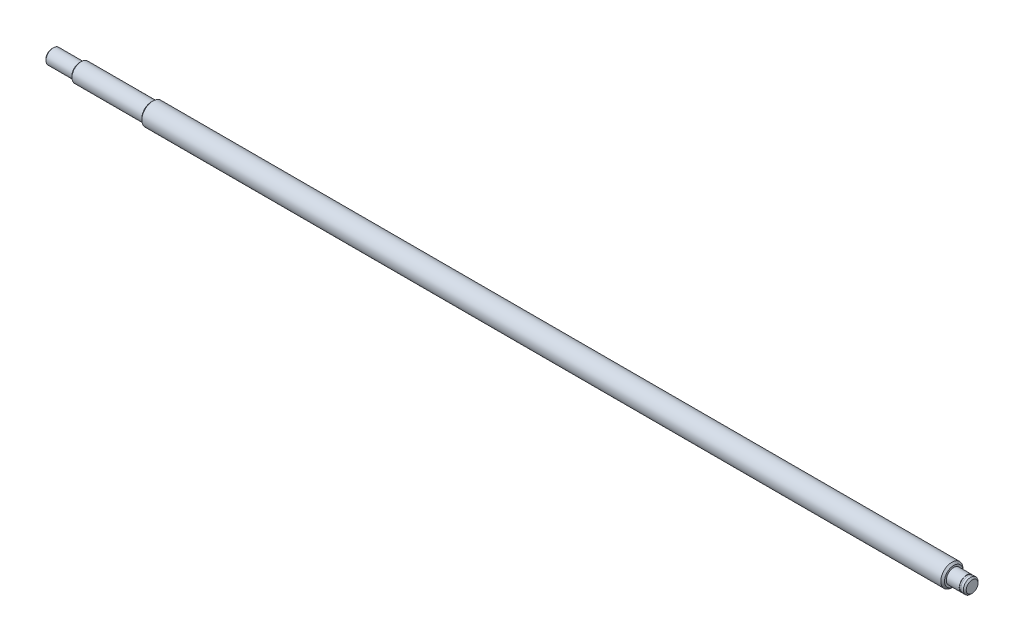
ISO-10303-21;
HEADER;
FILE_DESCRIPTION(('STEP AP214'),'2;1');
FILE_NAME('part.step','',(''),(''),'','','');
FILE_SCHEMA(('AUTOMOTIVE_DESIGN { 1 0 10303 214 1 1 1 1 }'));
ENDSEC;
DATA;
#1=APPLICATION_CONTEXT('core data for automotive mechanical design processes');
#2=APPLICATION_PROTOCOL_DEFINITION('international standard','automotive_design',2000,#1);
#3=PRODUCT_CONTEXT('',#1,'mechanical');
#4=PRODUCT('Part','Part','',(#3));
#5=PRODUCT_RELATED_PRODUCT_CATEGORY('part','',(#4));
#6=PRODUCT_DEFINITION_FORMATION('','',#4);
#7=PRODUCT_DEFINITION_CONTEXT('part definition',#1,'design');
#8=PRODUCT_DEFINITION('design','',#6,#7);
#9=PRODUCT_DEFINITION_SHAPE('','',#8);
#10=(LENGTH_UNIT() NAMED_UNIT(*) SI_UNIT(.MILLI.,.METRE.));
#11=(NAMED_UNIT(*) PLANE_ANGLE_UNIT() SI_UNIT($,.RADIAN.));
#12=(NAMED_UNIT(*) SI_UNIT($,.STERADIAN.) SOLID_ANGLE_UNIT());
#13=UNCERTAINTY_MEASURE_WITH_UNIT(LENGTH_MEASURE(1.E-05),#10,'distance_accuracy_value','');
#14=(GEOMETRIC_REPRESENTATION_CONTEXT(3) GLOBAL_UNCERTAINTY_ASSIGNED_CONTEXT((#13)) GLOBAL_UNIT_ASSIGNED_CONTEXT((#10,
#11,#12)) REPRESENTATION_CONTEXT('',''));
#15=CARTESIAN_POINT('',(0.,0.,0.));
#16=DIRECTION('',(0.,0.,1.));
#17=DIRECTION('',(1.,0.,0.));
#18=AXIS2_PLACEMENT_3D('',#15,#16,#17);
#19=CARTESIAN_POINT('',(-250.,0.,0.));
#20=DIRECTION('',(1.,0.,0.));
#21=DIRECTION('',(0.,1.,0.));
#22=AXIS2_PLACEMENT_3D('',#19,#20,#21);
#23=PLANE('',#22);
#24=CARTESIAN_POINT('',(-250.,0.,0.));
#25=DIRECTION('',(-1.,0.,0.));
#26=DIRECTION('',(0.,-1.,0.));
#27=AXIS2_PLACEMENT_3D('',#24,#25,#26);
#28=CIRCLE('',#27,3.19999999999995);
#29=CARTESIAN_POINT('',(-250.,-3.1999999999999,0.));
#30=VERTEX_POINT('',#29);
#31=EDGE_CURVE('E10',#30,#30,#28,.T.);
#32=ORIENTED_EDGE('',*,*,#31,.T.);
#33=EDGE_LOOP('',(#32));
#34=FACE_BOUND('',#33,.T.);
#35=ADVANCED_FACE('F30',(#34),#23,.F.);
#36=CARTESIAN_POINT('',(-249.2,0.,0.));
#37=DIRECTION('',(1.,0.,0.));
#38=DIRECTION('',(0.,1.,0.));
#39=AXIS2_PLACEMENT_3D('',#36,#37,#38);
#40=CONICAL_SURFACE('',#39,3.99999999999995,0.785398163397434);
#41=ORIENTED_EDGE('',*,*,#31,.F.);
#42=EDGE_LOOP('',(#41));
#43=FACE_BOUND('',#42,.T.);
#44=CARTESIAN_POINT('',(-249.2,0.,0.));
#45=DIRECTION('',(-1.,0.,0.));
#46=DIRECTION('',(0.,-1.,0.));
#47=AXIS2_PLACEMENT_3D('',#44,#45,#46);
#48=CIRCLE('',#47,3.99999999999995);
#49=CARTESIAN_POINT('',(-249.2,-3.9999999999999,0.));
#50=VERTEX_POINT('',#49);
#51=EDGE_CURVE('E36',#50,#50,#48,.T.);
#52=ORIENTED_EDGE('',*,*,#51,.T.);
#53=EDGE_LOOP('',(#52));
#54=FACE_BOUND('',#53,.T.);
#55=ADVANCED_FACE('F101',(#43,#54),#40,.T.);
#56=CARTESIAN_POINT('',(-511.970894611397,0.,0.));
#57=DIRECTION('',(-1.,0.,0.));
#58=DIRECTION('',(0.,-1.,0.));
#59=AXIS2_PLACEMENT_3D('',#56,#57,#58);
#60=CYLINDRICAL_SURFACE('',#59,3.99999999999995);
#61=ORIENTED_EDGE('',*,*,#51,.F.);
#62=EDGE_LOOP('',(#61));
#63=FACE_BOUND('',#62,.T.);
#64=CARTESIAN_POINT('',(-235.,0.,0.));
#65=DIRECTION('',(-1.,0.,0.));
#66=DIRECTION('',(0.,-1.,0.));
#67=AXIS2_PLACEMENT_3D('',#64,#65,#66);
#68=CIRCLE('',#67,3.99999999999995);
#69=CARTESIAN_POINT('',(-235.,-3.9999999999999,0.));
#70=VERTEX_POINT('',#69);
#71=EDGE_CURVE('E40',#70,#70,#68,.T.);
#72=ORIENTED_EDGE('',*,*,#71,.T.);
#73=EDGE_LOOP('',(#72));
#74=FACE_BOUND('',#73,.T.);
#75=ADVANCED_FACE('F105',(#63,#74),#60,.T.);
#76=CARTESIAN_POINT('',(-235.,4.,0.));
#77=DIRECTION('',(1.,0.,0.));
#78=DIRECTION('',(0.,1.,0.));
#79=AXIS2_PLACEMENT_3D('',#76,#77,#78);
#80=PLANE('',#79);
#81=ORIENTED_EDGE('',*,*,#71,.F.);
#82=EDGE_LOOP('',(#81));
#83=FACE_BOUND('',#82,.T.);
#84=CARTESIAN_POINT('',(-235.,0.,0.));
#85=DIRECTION('',(-1.,0.,0.));
#86=DIRECTION('',(0.,-1.,0.));
#87=AXIS2_PLACEMENT_3D('',#84,#85,#86);
#88=CIRCLE('',#87,4.09999999999995);
#89=CARTESIAN_POINT('',(-235.,-4.0999999999999,0.));
#90=VERTEX_POINT('',#89);
#91=EDGE_CURVE('E44',#90,#90,#88,.T.);
#92=ORIENTED_EDGE('',*,*,#91,.T.);
#93=EDGE_LOOP('',(#92));
#94=FACE_BOUND('',#93,.T.);
#95=ADVANCED_FACE('F110',(#83,#94),#80,.F.);
#96=CARTESIAN_POINT('',(-234.1,0.,0.));
#97=DIRECTION('',(1.,0.,0.));
#98=DIRECTION('',(0.,1.,0.));
#99=AXIS2_PLACEMENT_3D('',#96,#97,#98);
#100=CONICAL_SURFACE('',#99,4.99999999999995,0.785398163397442);
#101=ORIENTED_EDGE('',*,*,#91,.F.);
#102=EDGE_LOOP('',(#101));
#103=FACE_BOUND('',#102,.T.);
#104=CARTESIAN_POINT('',(-234.1,0.,0.));
#105=DIRECTION('',(-1.,0.,0.));
#106=DIRECTION('',(0.,-1.,0.));
#107=AXIS2_PLACEMENT_3D('',#104,#105,#106);
#108=CIRCLE('',#107,4.99999999999995);
#109=CARTESIAN_POINT('',(-234.1,-4.9999999999999,0.));
#110=VERTEX_POINT('',#109);
#111=EDGE_CURVE('E49',#110,#110,#108,.T.);
#112=ORIENTED_EDGE('',*,*,#111,.T.);
#113=EDGE_LOOP('',(#112));
#114=FACE_BOUND('',#113,.T.);
#115=ADVANCED_FACE('F116',(#103,#114),#100,.T.);
#116=CARTESIAN_POINT('',(-511.970894611397,0.,0.));
#117=DIRECTION('',(-1.,0.,0.));
#118=DIRECTION('',(0.,-1.,0.));
#119=AXIS2_PLACEMENT_3D('',#116,#117,#118);
#120=CYLINDRICAL_SURFACE('',#119,4.99999999999995);
#121=ORIENTED_EDGE('',*,*,#111,.F.);
#122=EDGE_LOOP('',(#121));
#123=FACE_BOUND('',#122,.T.);
#124=CARTESIAN_POINT('',(-196.,0.,0.));
#125=DIRECTION('',(-1.,0.,0.));
#126=DIRECTION('',(0.,-1.,0.));
#127=AXIS2_PLACEMENT_3D('',#124,#125,#126);
#128=CIRCLE('',#127,4.99999999999994);
#129=CARTESIAN_POINT('',(-196.,-4.99999999999988,0.));
#130=VERTEX_POINT('',#129);
#131=EDGE_CURVE('E52',#130,#130,#128,.T.);
#132=ORIENTED_EDGE('',*,*,#131,.T.);
#133=EDGE_LOOP('',(#132));
#134=FACE_BOUND('',#133,.T.);
#135=ADVANCED_FACE('F120',(#123,#134),#120,.T.);
#136=CARTESIAN_POINT('',(-196.,5.,0.));
#137=DIRECTION('',(1.,0.,0.));
#138=DIRECTION('',(0.,1.,0.));
#139=AXIS2_PLACEMENT_3D('',#136,#137,#138);
#140=PLANE('',#139);
#141=ORIENTED_EDGE('',*,*,#131,.F.);
#142=EDGE_LOOP('',(#141));
#143=FACE_BOUND('',#142,.T.);
#144=CARTESIAN_POINT('',(-196.,0.,0.));
#145=DIRECTION('',(-1.,0.,0.));
#146=DIRECTION('',(0.,-1.,0.));
#147=AXIS2_PLACEMENT_3D('',#144,#145,#146);
#148=CIRCLE('',#147,5.09999999999994);
#149=CARTESIAN_POINT('',(-196.,-5.09999999999988,0.));
#150=VERTEX_POINT('',#149);
#151=EDGE_CURVE('E55',#150,#150,#148,.T.);
#152=ORIENTED_EDGE('',*,*,#151,.T.);
#153=EDGE_LOOP('',(#152));
#154=FACE_BOUND('',#153,.T.);
#155=ADVANCED_FACE('F124',(#143,#154),#140,.F.);
#156=CARTESIAN_POINT('',(-195.1,0.,0.));
#157=DIRECTION('',(1.,0.,0.));
#158=DIRECTION('',(0.,1.,0.));
#159=AXIS2_PLACEMENT_3D('',#156,#157,#158);
#160=CONICAL_SURFACE('',#159,5.99999999999994,0.785398163397442);
#161=ORIENTED_EDGE('',*,*,#151,.F.);
#162=EDGE_LOOP('',(#161));
#163=FACE_BOUND('',#162,.T.);
#164=CARTESIAN_POINT('',(-195.1,0.,0.));
#165=DIRECTION('',(-1.,0.,0.));
#166=DIRECTION('',(0.,-1.,0.));
#167=AXIS2_PLACEMENT_3D('',#164,#165,#166);
#168=CIRCLE('',#167,5.99999999999994);
#169=CARTESIAN_POINT('',(-195.1,-5.99999999999988,0.));
#170=VERTEX_POINT('',#169);
#171=EDGE_CURVE('E58',#170,#170,#168,.T.);
#172=ORIENTED_EDGE('',*,*,#171,.T.);
#173=EDGE_LOOP('',(#172));
#174=FACE_BOUND('',#173,.T.);
#175=ADVANCED_FACE('F128',(#163,#174),#160,.T.);
#176=CARTESIAN_POINT('',(-511.970894611397,0.,0.));
#177=DIRECTION('',(-1.,0.,0.));
#178=DIRECTION('',(0.,-1.,0.));
#179=AXIS2_PLACEMENT_3D('',#176,#177,#178);
#180=CYLINDRICAL_SURFACE('',#179,5.9999999999999);
#181=ORIENTED_EDGE('',*,*,#171,.F.);
#182=EDGE_LOOP('',(#181));
#183=FACE_BOUND('',#182,.T.);
#184=CARTESIAN_POINT('',(239.,1.38089045109716E-13,0.));
#185=DIRECTION('',(-1.,0.,0.));
#186=DIRECTION('',(0.,-1.,0.));
#187=AXIS2_PLACEMENT_3D('',#184,#185,#186);
#188=CIRCLE('',#187,5.99999999999986);
#189=CARTESIAN_POINT('',(239.,-5.99999999999972,0.));
#190=VERTEX_POINT('',#189);
#191=EDGE_CURVE('E61',#190,#190,#188,.T.);
#192=ORIENTED_EDGE('',*,*,#191,.T.);
#193=EDGE_LOOP('',(#192));
#194=FACE_BOUND('',#193,.T.);
#195=ADVANCED_FACE('F132',(#183,#194),#180,.T.);
#196=CARTESIAN_POINT('',(240.,1.38272925798169E-13,0.));
#197=DIRECTION('',(-1.,0.,0.));
#198=DIRECTION('',(0.,-1.,0.));
#199=AXIS2_PLACEMENT_3D('',#196,#197,#198);
#200=CONICAL_SURFACE('',#199,4.99999999999989,0.785398163397432);
#201=ORIENTED_EDGE('',*,*,#191,.F.);
#202=EDGE_LOOP('',(#201));
#203=FACE_BOUND('',#202,.T.);
#204=CARTESIAN_POINT('',(240.,1.38272925798169E-13,0.));
#205=DIRECTION('',(-1.,0.,0.));
#206=DIRECTION('',(0.,-1.,0.));
#207=AXIS2_PLACEMENT_3D('',#204,#205,#206);
#208=CIRCLE('',#207,4.99999999999989);
#209=CARTESIAN_POINT('',(240.,-4.99999999999976,0.));
#210=VERTEX_POINT('',#209);
#211=EDGE_CURVE('E64',#210,#210,#208,.T.);
#212=ORIENTED_EDGE('',*,*,#211,.T.);
#213=EDGE_LOOP('',(#212));
#214=FACE_BOUND('',#213,.T.);
#215=ADVANCED_FACE('F136',(#203,#214),#200,.T.);
#216=CARTESIAN_POINT('',(240.,5.00000000000003,0.));
#217=DIRECTION('',(-1.,0.,0.));
#218=DIRECTION('',(0.,-1.,0.));
#219=AXIS2_PLACEMENT_3D('',#216,#217,#218);
#220=PLANE('',#219);
#221=ORIENTED_EDGE('',*,*,#211,.F.);
#222=EDGE_LOOP('',(#221));
#223=FACE_BOUND('',#222,.T.);
#224=CARTESIAN_POINT('',(240.,1.38272925798169E-13,0.));
#225=DIRECTION('',(-1.,0.,0.));
#226=DIRECTION('',(0.,-1.,0.));
#227=AXIS2_PLACEMENT_3D('',#224,#225,#226);
#228=CIRCLE('',#227,3.99999999999986);
#229=CARTESIAN_POINT('',(240.,-3.99999999999972,0.));
#230=VERTEX_POINT('',#229);
#231=EDGE_CURVE('E67',#230,#230,#228,.T.);
#232=ORIENTED_EDGE('',*,*,#231,.T.);
#233=EDGE_LOOP('',(#232));
#234=FACE_BOUND('',#233,.T.);
#235=ADVANCED_FACE('F140',(#223,#234),#220,.F.);
#236=CARTESIAN_POINT('',(-511.970894611397,0.,0.));
#237=DIRECTION('',(-1.,0.,0.));
#238=DIRECTION('',(0.,-1.,0.));
#239=AXIS2_PLACEMENT_3D('',#236,#237,#238);
#240=CYLINDRICAL_SURFACE('',#239,3.99999999999986);
#241=ORIENTED_EDGE('',*,*,#231,.F.);
#242=EDGE_LOOP('',(#241));
#243=FACE_BOUND('',#242,.T.);
#244=CARTESIAN_POINT('',(247.,1.39560090617344E-13,0.));
#245=DIRECTION('',(-1.,0.,0.));
#246=DIRECTION('',(0.,-1.,0.));
#247=AXIS2_PLACEMENT_3D('',#244,#245,#246);
#248=CIRCLE('',#247,3.99999999999986);
#249=CARTESIAN_POINT('',(247.,-3.99999999999972,0.));
#250=VERTEX_POINT('',#249);
#251=EDGE_CURVE('E70',#250,#250,#248,.T.);
#252=ORIENTED_EDGE('',*,*,#251,.T.);
#253=EDGE_LOOP('',(#252));
#254=FACE_BOUND('',#253,.T.);
#255=ADVANCED_FACE('F144',(#243,#254),#240,.T.);
#256=CARTESIAN_POINT('',(247.,4.,0.));
#257=DIRECTION('',(-1.,0.,0.));
#258=DIRECTION('',(0.,-1.,0.));
#259=AXIS2_PLACEMENT_3D('',#256,#257,#258);
#260=PLANE('',#259);
#261=ORIENTED_EDGE('',*,*,#251,.F.);
#262=EDGE_LOOP('',(#261));
#263=FACE_BOUND('',#262,.T.);
#264=CARTESIAN_POINT('',(247.,1.39560090617344E-13,0.));
#265=DIRECTION('',(-1.,0.,0.));
#266=DIRECTION('',(0.,-1.,0.));
#267=AXIS2_PLACEMENT_3D('',#264,#265,#266);
#268=CIRCLE('',#267,3.79999999999986);
#269=CARTESIAN_POINT('',(247.,-3.79999999999972,0.));
#270=VERTEX_POINT('',#269);
#271=EDGE_CURVE('E73',#270,#270,#268,.T.);
#272=ORIENTED_EDGE('',*,*,#271,.T.);
#273=EDGE_LOOP('',(#272));
#274=FACE_BOUND('',#273,.T.);
#275=ADVANCED_FACE('F148',(#263,#274),#260,.F.);
#276=CARTESIAN_POINT('',(-511.970894611397,0.,0.));
#277=DIRECTION('',(-1.,0.,0.));
#278=DIRECTION('',(0.,-1.,0.));
#279=AXIS2_PLACEMENT_3D('',#276,#277,#278);
#280=CYLINDRICAL_SURFACE('',#279,3.79999999999986);
#281=ORIENTED_EDGE('',*,*,#271,.F.);
#282=EDGE_LOOP('',(#281));
#283=FACE_BOUND('',#282,.T.);
#284=CARTESIAN_POINT('',(247.9,1.39725583236952E-13,0.));
#285=DIRECTION('',(-1.,0.,0.));
#286=DIRECTION('',(0.,-1.,0.));
#287=AXIS2_PLACEMENT_3D('',#284,#285,#286);
#288=CIRCLE('',#287,3.79999999999986);
#289=CARTESIAN_POINT('',(247.9,-3.79999999999972,0.));
#290=VERTEX_POINT('',#289);
#291=EDGE_CURVE('E76',#290,#290,#288,.T.);
#292=ORIENTED_EDGE('',*,*,#291,.T.);
#293=EDGE_LOOP('',(#292));
#294=FACE_BOUND('',#293,.T.);
#295=ADVANCED_FACE('F152',(#283,#294),#280,.T.);
#296=CARTESIAN_POINT('',(247.9,3.8,0.));
#297=DIRECTION('',(1.,0.,0.));
#298=DIRECTION('',(0.,1.,0.));
#299=AXIS2_PLACEMENT_3D('',#296,#297,#298);
#300=PLANE('',#299);
#301=ORIENTED_EDGE('',*,*,#291,.F.);
#302=EDGE_LOOP('',(#301));
#303=FACE_BOUND('',#302,.T.);
#304=CARTESIAN_POINT('',(247.9,1.39725583236952E-13,0.));
#305=DIRECTION('',(-1.,0.,0.));
#306=DIRECTION('',(0.,-1.,0.));
#307=AXIS2_PLACEMENT_3D('',#304,#305,#306);
#308=CIRCLE('',#307,3.99999999999986);
#309=CARTESIAN_POINT('',(247.9,-3.99999999999972,0.));
#310=VERTEX_POINT('',#309);
#311=EDGE_CURVE('E79',#310,#310,#308,.T.);
#312=ORIENTED_EDGE('',*,*,#311,.T.);
#313=EDGE_LOOP('',(#312));
#314=FACE_BOUND('',#313,.T.);
#315=ADVANCED_FACE('F156',(#303,#314),#300,.F.);
#316=CARTESIAN_POINT('',(-511.970894611397,0.,0.));
#317=DIRECTION('',(-1.,0.,0.));
#318=DIRECTION('',(0.,-1.,0.));
#319=AXIS2_PLACEMENT_3D('',#316,#317,#318);
#320=CYLINDRICAL_SURFACE('',#319,3.99999999999986);
#321=ORIENTED_EDGE('',*,*,#311,.F.);
#322=EDGE_LOOP('',(#321));
#323=FACE_BOUND('',#322,.T.);
#324=CARTESIAN_POINT('',(249.2,1.39964628131942E-13,0.));
#325=DIRECTION('',(-1.,0.,0.));
#326=DIRECTION('',(0.,-1.,0.));
#327=AXIS2_PLACEMENT_3D('',#324,#325,#326);
#328=CIRCLE('',#327,3.99999999999986);
#329=CARTESIAN_POINT('',(249.2,-3.99999999999972,0.));
#330=VERTEX_POINT('',#329);
#331=EDGE_CURVE('E82',#330,#330,#328,.T.);
#332=ORIENTED_EDGE('',*,*,#331,.T.);
#333=EDGE_LOOP('',(#332));
#334=FACE_BOUND('',#333,.T.);
#335=ADVANCED_FACE('F97',(#323,#334),#320,.T.);
#336=CARTESIAN_POINT('',(250.,1.40111732682705E-13,0.));
#337=DIRECTION('',(-1.,0.,0.));
#338=DIRECTION('',(0.,-1.,0.));
#339=AXIS2_PLACEMENT_3D('',#336,#337,#338);
#340=CONICAL_SURFACE('',#339,3.19999999999988,0.78539816339742);
#341=ORIENTED_EDGE('',*,*,#331,.F.);
#342=EDGE_LOOP('',(#341));
#343=FACE_BOUND('',#342,.T.);
#344=CARTESIAN_POINT('',(250.,1.40111732682705E-13,0.));
#345=DIRECTION('',(-1.,0.,0.));
#346=DIRECTION('',(0.,-1.,0.));
#347=AXIS2_PLACEMENT_3D('',#344,#345,#346);
#348=CIRCLE('',#347,3.19999999999988);
#349=CARTESIAN_POINT('',(250.,-3.19999999999974,0.));
#350=VERTEX_POINT('',#349);
#351=EDGE_CURVE('E85',#350,#350,#348,.T.);
#352=ORIENTED_EDGE('',*,*,#351,.T.);
#353=EDGE_LOOP('',(#352));
#354=FACE_BOUND('',#353,.T.);
#355=ADVANCED_FACE('F89',(#343,#354),#340,.T.);
#356=CARTESIAN_POINT('',(250.,3.20000000000002,0.));
#357=DIRECTION('',(-1.,0.,0.));
#358=DIRECTION('',(0.,-1.,0.));
#359=AXIS2_PLACEMENT_3D('',#356,#357,#358);
#360=PLANE('',#359);
#361=ORIENTED_EDGE('',*,*,#351,.F.);
#362=EDGE_LOOP('',(#361));
#363=FACE_BOUND('',#362,.T.);
#364=ADVANCED_FACE('F91',(#363),#360,.F.);
#365=CLOSED_SHELL('',(#35,#55,#75,#95,#115,#135,#155,#175,#195,#215,#235,#255,#275,#295,#315,
#335,#355,#364));
#366=MANIFOLD_SOLID_BREP('B2',#365);
#367=ADVANCED_BREP_SHAPE_REPRESENTATION('',(#18,#366),#14);
#368=SHAPE_DEFINITION_REPRESENTATION(#9,#367);
ENDSEC;
END-ISO-10303-21;
